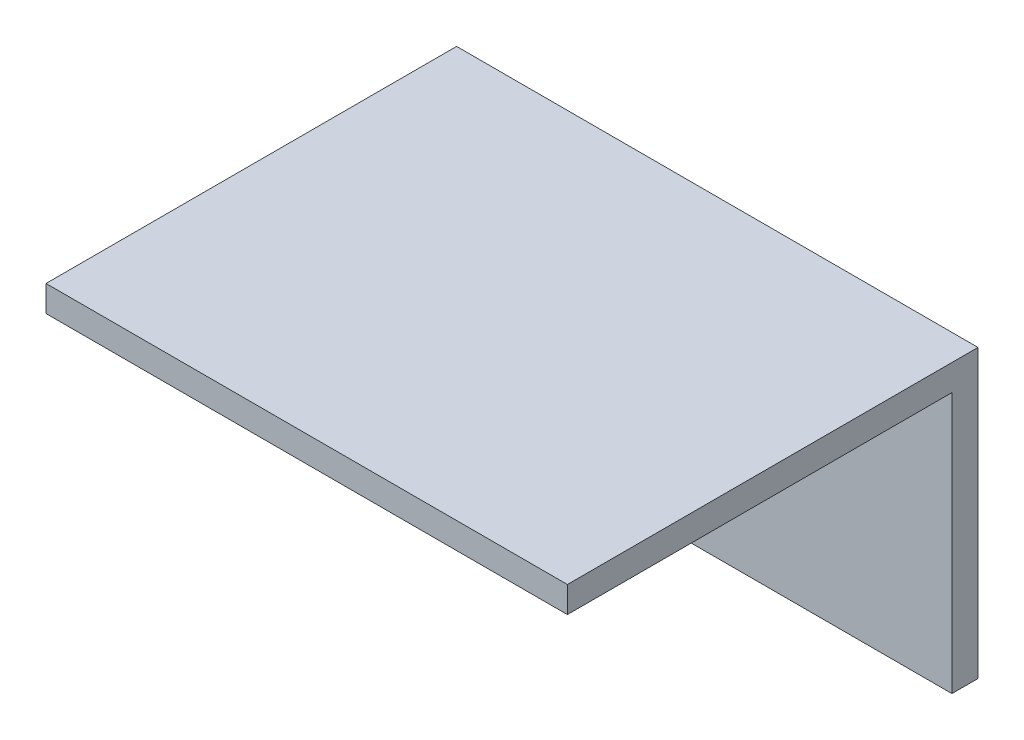
ISO-10303-21;
HEADER;
FILE_DESCRIPTION(('STEP AP214'),'2;1');
FILE_NAME('part.step','',(''),(''),'','','');
FILE_SCHEMA(('AUTOMOTIVE_DESIGN { 1 0 10303 214 1 1 1 1 }'));
ENDSEC;
DATA;
#1=APPLICATION_CONTEXT('core data for automotive mechanical design processes');
#2=APPLICATION_PROTOCOL_DEFINITION('international standard','automotive_design',2000,#1);
#3=PRODUCT_CONTEXT('',#1,'mechanical');
#4=PRODUCT('Part','Part','',(#3));
#5=PRODUCT_RELATED_PRODUCT_CATEGORY('part','',(#4));
#6=PRODUCT_DEFINITION_FORMATION('','',#4);
#7=PRODUCT_DEFINITION_CONTEXT('part definition',#1,'design');
#8=PRODUCT_DEFINITION('design','',#6,#7);
#9=PRODUCT_DEFINITION_SHAPE('','',#8);
#10=(LENGTH_UNIT() NAMED_UNIT(*) SI_UNIT(.MILLI.,.METRE.));
#11=(NAMED_UNIT(*) PLANE_ANGLE_UNIT() SI_UNIT($,.RADIAN.));
#12=(NAMED_UNIT(*) SI_UNIT($,.STERADIAN.) SOLID_ANGLE_UNIT());
#13=UNCERTAINTY_MEASURE_WITH_UNIT(LENGTH_MEASURE(1.E-05),#10,'distance_accuracy_value','');
#14=(GEOMETRIC_REPRESENTATION_CONTEXT(3) GLOBAL_UNCERTAINTY_ASSIGNED_CONTEXT((#13)) GLOBAL_UNIT_ASSIGNED_CONTEXT((#10,
#11,#12)) REPRESENTATION_CONTEXT('',''));
#15=CARTESIAN_POINT('',(0.,0.,0.));
#16=DIRECTION('',(0.,0.,1.));
#17=DIRECTION('',(1.,0.,0.));
#18=AXIS2_PLACEMENT_3D('',#15,#16,#17);
#19=CARTESIAN_POINT('',(55.6258807045636,2.,-4.77457465972779));
#20=DIRECTION('',(0.,0.,-1.));
#21=DIRECTION('',(-1.,0.,0.));
#22=AXIS2_PLACEMENT_3D('',#19,#20,#21);
#23=PLANE('',#22);
#24=DIRECTION('',(1.,0.,0.));
#25=VECTOR('',#24,1.);
#26=CARTESIAN_POINT('',(55.6258807045636,0.,-4.77457465972779));
#27=LINE('',#26,#25);
#28=CARTESIAN_POINT('',(15.6258807045637,0.,-4.77457465972779));
#29=VERTEX_POINT('',#28);
#30=CARTESIAN_POINT('',(55.6258807045636,0.,-4.77457465972779));
#31=VERTEX_POINT('',#30);
#32=EDGE_CURVE('E84',#29,#31,#27,.T.);
#33=ORIENTED_EDGE('',*,*,#32,.T.);
#34=DIRECTION('',(0.,-1.,0.));
#35=VECTOR('',#34,1.);
#36=CARTESIAN_POINT('',(55.6258807045636,2.,-4.77457465972779));
#37=LINE('',#36,#35);
#38=CARTESIAN_POINT('',(55.6258807045636,2.,-4.77457465972779));
#39=VERTEX_POINT('',#38);
#40=EDGE_CURVE('E11',#39,#31,#37,.T.);
#41=ORIENTED_EDGE('',*,*,#40,.F.);
#42=DIRECTION('',(1.,0.,0.));
#43=VECTOR('',#42,1.);
#44=CARTESIAN_POINT('',(55.6258807045636,2.,-4.77457465972779));
#45=LINE('',#44,#43);
#46=CARTESIAN_POINT('',(15.6258807045637,2.,-4.77457465972779));
#47=VERTEX_POINT('',#46);
#48=EDGE_CURVE('E78',#47,#39,#45,.T.);
#49=ORIENTED_EDGE('',*,*,#48,.F.);
#50=DIRECTION('',(0.,-1.,0.));
#51=VECTOR('',#50,1.);
#52=CARTESIAN_POINT('',(15.6258807045637,2.,-4.77457465972779));
#53=LINE('',#52,#51);
#54=EDGE_CURVE('E41',#47,#29,#53,.T.);
#55=ORIENTED_EDGE('',*,*,#54,.T.);
#56=EDGE_LOOP('',(#33,#41,#49,#55));
#57=FACE_BOUND('',#56,.T.);
#58=ADVANCED_FACE('F33',(#57),#23,.F.);
#59=CARTESIAN_POINT('',(55.6258807045636,2.,-34.2745746597278));
#60=DIRECTION('',(-1.,0.,0.));
#61=DIRECTION('',(0.,0.,1.));
#62=AXIS2_PLACEMENT_3D('',#59,#60,#61);
#63=PLANE('',#62);
#64=DIRECTION('',(0.,0.,-1.));
#65=VECTOR('',#64,1.);
#66=CARTESIAN_POINT('',(55.6258807045636,0.,-34.2745746597278));
#67=LINE('',#66,#65);
#68=CARTESIAN_POINT('',(55.6258807045636,0.,-34.2745746597278));
#69=VERTEX_POINT('',#68);
#70=EDGE_CURVE('E62',#31,#69,#67,.T.);
#71=ORIENTED_EDGE('',*,*,#70,.T.);
#72=DIRECTION('',(0.,1.,0.));
#73=VECTOR('',#72,1.);
#74=CARTESIAN_POINT('',(55.6258807045636,-20.,-34.2745746597278));
#75=LINE('',#74,#73);
#76=CARTESIAN_POINT('',(55.6258807045636,-20.,-34.2745746597278));
#77=VERTEX_POINT('',#76);
#78=EDGE_CURVE('E99',#77,#69,#75,.T.);
#79=ORIENTED_EDGE('',*,*,#78,.F.);
#80=DIRECTION('',(0.,0.,-1.));
#81=VECTOR('',#80,1.);
#82=CARTESIAN_POINT('',(55.6258807045636,-20.,-34.2745746597278));
#83=LINE('',#82,#81);
#84=CARTESIAN_POINT('',(55.6258807045636,-20.,-36.2745746597278));
#85=VERTEX_POINT('',#84);
#86=EDGE_CURVE('E118',#77,#85,#83,.T.);
#87=ORIENTED_EDGE('',*,*,#86,.T.);
#88=DIRECTION('',(0.,1.,0.));
#89=VECTOR('',#88,1.);
#90=CARTESIAN_POINT('',(55.6258807045636,-20.,-36.2745746597278));
#91=LINE('',#90,#89);
#92=CARTESIAN_POINT('',(55.6258807045636,2.,-36.2745746597278));
#93=VERTEX_POINT('',#92);
#94=EDGE_CURVE('E119',#85,#93,#91,.T.);
#95=ORIENTED_EDGE('',*,*,#94,.T.);
#96=DIRECTION('',(0.,0.,-1.));
#97=VECTOR('',#96,1.);
#98=CARTESIAN_POINT('',(55.6258807045636,2.,-34.2745746597278));
#99=LINE('',#98,#97);
#100=EDGE_CURVE('E139',#39,#93,#99,.T.);
#101=ORIENTED_EDGE('',*,*,#100,.F.);
#102=ORIENTED_EDGE('',*,*,#40,.T.);
#103=EDGE_LOOP('',(#71,#79,#87,#95,#101,#102));
#104=FACE_BOUND('',#103,.T.);
#105=ADVANCED_FACE('F116',(#104),#63,.F.);
#106=CARTESIAN_POINT('',(15.6258807045637,2.,-4.77457465972779));
#107=DIRECTION('',(1.,0.,0.));
#108=DIRECTION('',(0.,0.,-1.));
#109=AXIS2_PLACEMENT_3D('',#106,#107,#108);
#110=PLANE('',#109);
#111=DIRECTION('',(0.,0.,1.));
#112=VECTOR('',#111,1.);
#113=CARTESIAN_POINT('',(15.6258807045637,0.,-4.77457465972779));
#114=LINE('',#113,#112);
#115=CARTESIAN_POINT('',(15.6258807045636,0.,-34.2745746597278));
#116=VERTEX_POINT('',#115);
#117=EDGE_CURVE('E68',#116,#29,#114,.T.);
#118=ORIENTED_EDGE('',*,*,#117,.T.);
#119=ORIENTED_EDGE('',*,*,#54,.F.);
#120=DIRECTION('',(0.,0.,1.));
#121=VECTOR('',#120,1.);
#122=CARTESIAN_POINT('',(15.6258807045637,2.,-4.77457465972779));
#123=LINE('',#122,#121);
#124=CARTESIAN_POINT('',(15.6258807045636,2.,-36.2745746597278));
#125=VERTEX_POINT('',#124);
#126=EDGE_CURVE('E49',#125,#47,#123,.T.);
#127=ORIENTED_EDGE('',*,*,#126,.F.);
#128=DIRECTION('',(0.,1.,0.));
#129=VECTOR('',#128,1.);
#130=CARTESIAN_POINT('',(15.6258807045636,-20.,-36.2745746597278));
#131=LINE('',#130,#129);
#132=CARTESIAN_POINT('',(15.6258807045636,-20.,-36.2745746597278));
#133=VERTEX_POINT('',#132);
#134=EDGE_CURVE('E88',#133,#125,#131,.T.);
#135=ORIENTED_EDGE('',*,*,#134,.F.);
#136=DIRECTION('',(0.,0.,1.));
#137=VECTOR('',#136,1.);
#138=CARTESIAN_POINT('',(15.6258807045636,-20.,-36.2745746597278));
#139=LINE('',#138,#137);
#140=CARTESIAN_POINT('',(15.6258807045636,-20.,-34.2745746597278));
#141=VERTEX_POINT('',#140);
#142=EDGE_CURVE('E120',#133,#141,#139,.T.);
#143=ORIENTED_EDGE('',*,*,#142,.T.);
#144=DIRECTION('',(0.,1.,0.));
#145=VECTOR('',#144,1.);
#146=CARTESIAN_POINT('',(15.6258807045636,-20.,-34.2745746597278));
#147=LINE('',#146,#145);
#148=EDGE_CURVE('E74',#141,#116,#147,.T.);
#149=ORIENTED_EDGE('',*,*,#148,.T.);
#150=EDGE_LOOP('',(#118,#119,#127,#135,#143,#149));
#151=FACE_BOUND('',#150,.T.);
#152=ADVANCED_FACE('F70',(#151),#110,.F.);
#153=CARTESIAN_POINT('',(0.,2.,0.));
#154=DIRECTION('',(0.,-1.,0.));
#155=DIRECTION('',(0.,0.,-1.));
#156=AXIS2_PLACEMENT_3D('',#153,#154,#155);
#157=PLANE('',#156);
#158=ORIENTED_EDGE('',*,*,#48,.T.);
#159=ORIENTED_EDGE('',*,*,#100,.T.);
#160=DIRECTION('',(-1.,0.,0.));
#161=VECTOR('',#160,1.);
#162=CARTESIAN_POINT('',(55.6258807045636,2.,-36.2745746597278));
#163=LINE('',#162,#161);
#164=EDGE_CURVE('E130',#93,#125,#163,.T.);
#165=ORIENTED_EDGE('',*,*,#164,.T.);
#166=ORIENTED_EDGE('',*,*,#126,.T.);
#167=EDGE_LOOP('',(#158,#159,#165,#166));
#168=FACE_BOUND('',#167,.T.);
#169=ADVANCED_FACE('F140',(#168),#157,.F.);
#170=CARTESIAN_POINT('',(0.,0.,0.));
#171=DIRECTION('',(0.,-1.,0.));
#172=DIRECTION('',(0.,0.,-1.));
#173=AXIS2_PLACEMENT_3D('',#170,#171,#172);
#174=PLANE('',#173);
#175=ORIENTED_EDGE('',*,*,#32,.F.);
#176=ORIENTED_EDGE('',*,*,#117,.F.);
#177=DIRECTION('',(-1.,0.,0.));
#178=VECTOR('',#177,1.);
#179=CARTESIAN_POINT('',(15.6258807045636,0.,-34.2745746597278));
#180=LINE('',#179,#178);
#181=EDGE_CURVE('E79',#69,#116,#180,.T.);
#182=ORIENTED_EDGE('',*,*,#181,.F.);
#183=ORIENTED_EDGE('',*,*,#70,.F.);
#184=EDGE_LOOP('',(#175,#176,#182,#183));
#185=FACE_BOUND('',#184,.T.);
#186=ADVANCED_FACE('F85',(#185),#174,.T.);
#187=CARTESIAN_POINT('',(15.6258807045636,-20.,-34.2745746597278));
#188=DIRECTION('',(0.,0.,1.));
#189=DIRECTION('',(1.,0.,0.));
#190=AXIS2_PLACEMENT_3D('',#187,#188,#189);
#191=PLANE('',#190);
#192=ORIENTED_EDGE('',*,*,#78,.T.);
#193=ORIENTED_EDGE('',*,*,#181,.T.);
#194=ORIENTED_EDGE('',*,*,#148,.F.);
#195=DIRECTION('',(1.,0.,0.));
#196=VECTOR('',#195,1.);
#197=CARTESIAN_POINT('',(15.6258807045636,-20.,-34.2745746597278));
#198=LINE('',#197,#196);
#199=EDGE_CURVE('E126',#141,#77,#198,.T.);
#200=ORIENTED_EDGE('',*,*,#199,.T.);
#201=EDGE_LOOP('',(#192,#193,#194,#200));
#202=FACE_BOUND('',#201,.T.);
#203=ADVANCED_FACE('F95',(#202),#191,.T.);
#204=CARTESIAN_POINT('',(55.6258807045636,-20.,-36.2745746597278));
#205=DIRECTION('',(0.,0.,-1.));
#206=DIRECTION('',(-1.,0.,0.));
#207=AXIS2_PLACEMENT_3D('',#204,#205,#206);
#208=PLANE('',#207);
#209=ORIENTED_EDGE('',*,*,#164,.F.);
#210=ORIENTED_EDGE('',*,*,#94,.F.);
#211=DIRECTION('',(-1.,0.,0.));
#212=VECTOR('',#211,1.);
#213=CARTESIAN_POINT('',(55.6258807045636,-20.,-36.2745746597278));
#214=LINE('',#213,#212);
#215=EDGE_CURVE('E128',#85,#133,#214,.T.);
#216=ORIENTED_EDGE('',*,*,#215,.T.);
#217=ORIENTED_EDGE('',*,*,#134,.T.);
#218=EDGE_LOOP('',(#209,#210,#216,#217));
#219=FACE_BOUND('',#218,.T.);
#220=ADVANCED_FACE('F143',(#219),#208,.T.);
#221=CARTESIAN_POINT('',(0.,-20.,0.));
#222=DIRECTION('',(0.,1.,0.));
#223=DIRECTION('',(0.,0.,1.));
#224=AXIS2_PLACEMENT_3D('',#221,#222,#223);
#225=PLANE('',#224);
#226=ORIENTED_EDGE('',*,*,#199,.F.);
#227=ORIENTED_EDGE('',*,*,#142,.F.);
#228=ORIENTED_EDGE('',*,*,#215,.F.);
#229=ORIENTED_EDGE('',*,*,#86,.F.);
#230=EDGE_LOOP('',(#226,#227,#228,#229));
#231=FACE_BOUND('',#230,.T.);
#232=ADVANCED_FACE('F124',(#231),#225,.F.);
#233=CLOSED_SHELL('',(#58,#105,#152,#169,#186,#203,#220,#232));
#234=MANIFOLD_SOLID_BREP('B2',#233);
#235=ADVANCED_BREP_SHAPE_REPRESENTATION('',(#18,#234),#14);
#236=SHAPE_DEFINITION_REPRESENTATION(#9,#235);
ENDSEC;
END-ISO-10303-21;
